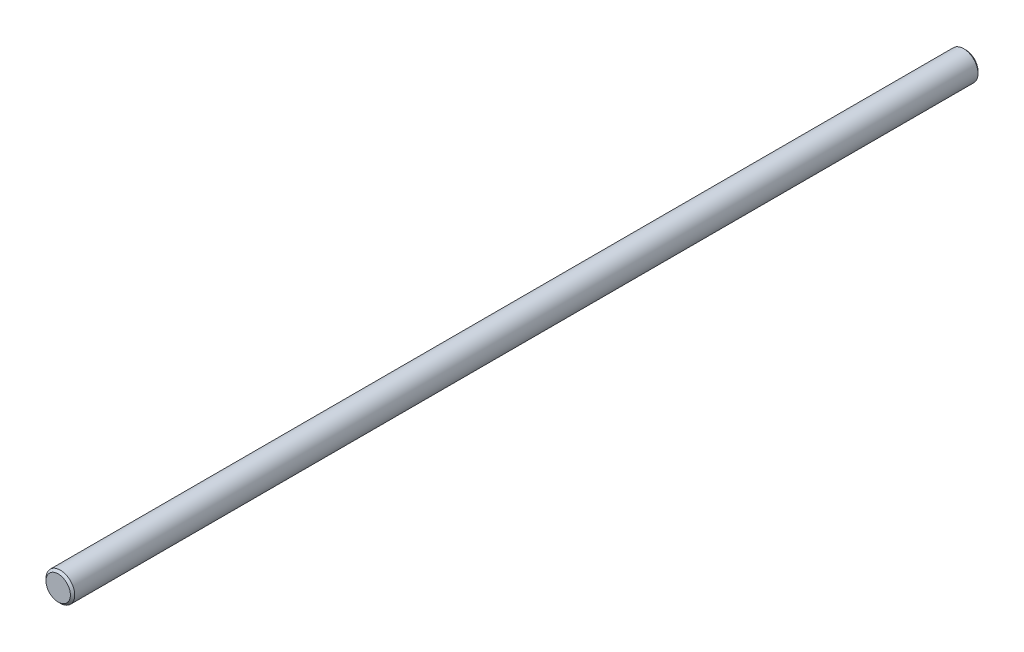
ISO-10303-21;
HEADER;
FILE_DESCRIPTION(('STEP AP214'),'2;1');
FILE_NAME('part.step','',(''),(''),'','','');
FILE_SCHEMA(('AUTOMOTIVE_DESIGN { 1 0 10303 214 1 1 1 1 }'));
ENDSEC;
DATA;
#1=APPLICATION_CONTEXT('core data for automotive mechanical design processes');
#2=APPLICATION_PROTOCOL_DEFINITION('international standard','automotive_design',2000,#1);
#3=PRODUCT_CONTEXT('',#1,'mechanical');
#4=PRODUCT('Part','Part','',(#3));
#5=PRODUCT_RELATED_PRODUCT_CATEGORY('part','',(#4));
#6=PRODUCT_DEFINITION_FORMATION('','',#4);
#7=PRODUCT_DEFINITION_CONTEXT('part definition',#1,'design');
#8=PRODUCT_DEFINITION('design','',#6,#7);
#9=PRODUCT_DEFINITION_SHAPE('','',#8);
#10=(LENGTH_UNIT() NAMED_UNIT(*) SI_UNIT(.MILLI.,.METRE.));
#11=(NAMED_UNIT(*) PLANE_ANGLE_UNIT() SI_UNIT($,.RADIAN.));
#12=(NAMED_UNIT(*) SI_UNIT($,.STERADIAN.) SOLID_ANGLE_UNIT());
#13=UNCERTAINTY_MEASURE_WITH_UNIT(LENGTH_MEASURE(1.E-05),#10,'distance_accuracy_value','');
#14=(GEOMETRIC_REPRESENTATION_CONTEXT(3) GLOBAL_UNCERTAINTY_ASSIGNED_CONTEXT((#13)) GLOBAL_UNIT_ASSIGNED_CONTEXT((#10,
#11,#12)) REPRESENTATION_CONTEXT('',''));
#15=CARTESIAN_POINT('',(0.,0.,0.));
#16=DIRECTION('',(0.,0.,1.));
#17=DIRECTION('',(1.,0.,0.));
#18=AXIS2_PLACEMENT_3D('',#15,#16,#17);
#19=CARTESIAN_POINT('',(0.,0.,76.2));
#20=DIRECTION('',(0.,0.,-1.));
#21=DIRECTION('',(-1.,0.,0.));
#22=AXIS2_PLACEMENT_3D('',#19,#20,#21);
#23=CYLINDRICAL_SURFACE('',#22,2.41299999999997);
#24=CARTESIAN_POINT('',(0.,0.,-75.8380500000001));
#25=DIRECTION('',(0.,0.,1.));
#26=DIRECTION('',(1.,0.,0.));
#27=AXIS2_PLACEMENT_3D('',#24,#25,#26);
#28=CIRCLE('',#27,2.41299999999997);
#29=CARTESIAN_POINT('',(2.41299999999997,0.,-75.8380500000001));
#30=VERTEX_POINT('',#29);
#31=EDGE_CURVE('E47',#30,#30,#28,.T.);
#32=ORIENTED_EDGE('',*,*,#31,.T.);
#33=EDGE_LOOP('',(#32));
#34=FACE_BOUND('',#33,.T.);
#35=CARTESIAN_POINT('',(0.,0.,75.8380500000001));
#36=DIRECTION('',(0.,0.,1.));
#37=DIRECTION('',(1.,0.,0.));
#38=AXIS2_PLACEMENT_3D('',#35,#36,#37);
#39=CIRCLE('',#38,2.41299999999997);
#40=CARTESIAN_POINT('',(2.41299999999997,0.,75.8380500000001));
#41=VERTEX_POINT('',#40);
#42=EDGE_CURVE('E51',#41,#41,#39,.F.);
#43=ORIENTED_EDGE('',*,*,#42,.T.);
#44=EDGE_LOOP('',(#43));
#45=FACE_BOUND('',#44,.T.);
#46=ADVANCED_FACE('F36',(#34,#45),#23,.T.);
#47=CARTESIAN_POINT('',(0.,0.,76.2));
#48=DIRECTION('',(0.,0.,1.));
#49=DIRECTION('',(1.,0.,0.));
#50=AXIS2_PLACEMENT_3D('',#47,#48,#49);
#51=PLANE('',#50);
#52=CARTESIAN_POINT('',(0.,0.,76.2));
#53=DIRECTION('',(0.,0.,1.));
#54=DIRECTION('',(1.,0.,0.));
#55=AXIS2_PLACEMENT_3D('',#52,#53,#54);
#56=CIRCLE('',#55,2.05105000000001);
#57=CARTESIAN_POINT('',(2.05105000000001,0.,76.2));
#58=VERTEX_POINT('',#57);
#59=EDGE_CURVE('E10',#58,#58,#56,.T.);
#60=ORIENTED_EDGE('',*,*,#59,.T.);
#61=EDGE_LOOP('',(#60));
#62=FACE_BOUND('',#61,.T.);
#63=ADVANCED_FACE('F67',(#62),#51,.T.);
#64=CARTESIAN_POINT('',(0.,0.,-76.2));
#65=DIRECTION('',(0.,0.,1.));
#66=DIRECTION('',(1.,0.,0.));
#67=AXIS2_PLACEMENT_3D('',#64,#65,#66);
#68=PLANE('',#67);
#69=CARTESIAN_POINT('',(0.,0.,-76.2));
#70=DIRECTION('',(0.,0.,1.));
#71=DIRECTION('',(1.,0.,0.));
#72=AXIS2_PLACEMENT_3D('',#69,#70,#71);
#73=CIRCLE('',#72,2.05104999999998);
#74=CARTESIAN_POINT('',(2.05104999999998,0.,-76.2));
#75=VERTEX_POINT('',#74);
#76=EDGE_CURVE('E43',#75,#75,#73,.F.);
#77=ORIENTED_EDGE('',*,*,#76,.T.);
#78=EDGE_LOOP('',(#77));
#79=FACE_BOUND('',#78,.T.);
#80=ADVANCED_FACE('F64',(#79),#68,.F.);
#81=CARTESIAN_POINT('',(0.,0.,-75.8380500000001));
#82=DIRECTION('',(0.,0.,1.));
#83=DIRECTION('',(1.,0.,0.));
#84=AXIS2_PLACEMENT_3D('',#81,#82,#83);
#85=CONICAL_SURFACE('',#84,2.41299999999997,0.785398163397434);
#86=ORIENTED_EDGE('',*,*,#76,.F.);
#87=EDGE_LOOP('',(#86));
#88=FACE_BOUND('',#87,.T.);
#89=ORIENTED_EDGE('',*,*,#31,.F.);
#90=EDGE_LOOP('',(#89));
#91=FACE_BOUND('',#90,.T.);
#92=ADVANCED_FACE('F60',(#88,#91),#85,.T.);
#93=CARTESIAN_POINT('',(0.,0.,76.2));
#94=DIRECTION('',(0.,0.,-1.));
#95=DIRECTION('',(-1.,0.,0.));
#96=AXIS2_PLACEMENT_3D('',#93,#94,#95);
#97=CONICAL_SURFACE('',#96,2.05105000000001,0.785398163397453);
#98=ORIENTED_EDGE('',*,*,#42,.F.);
#99=EDGE_LOOP('',(#98));
#100=FACE_BOUND('',#99,.T.);
#101=ORIENTED_EDGE('',*,*,#59,.F.);
#102=EDGE_LOOP('',(#101));
#103=FACE_BOUND('',#102,.T.);
#104=ADVANCED_FACE('F38',(#100,#103),#97,.T.);
#105=CLOSED_SHELL('',(#46,#63,#80,#92,#104));
#106=MANIFOLD_SOLID_BREP('B2',#105);
#107=ADVANCED_BREP_SHAPE_REPRESENTATION('',(#18,#106),#14);
#108=SHAPE_DEFINITION_REPRESENTATION(#9,#107);
ENDSEC;
END-ISO-10303-21;
